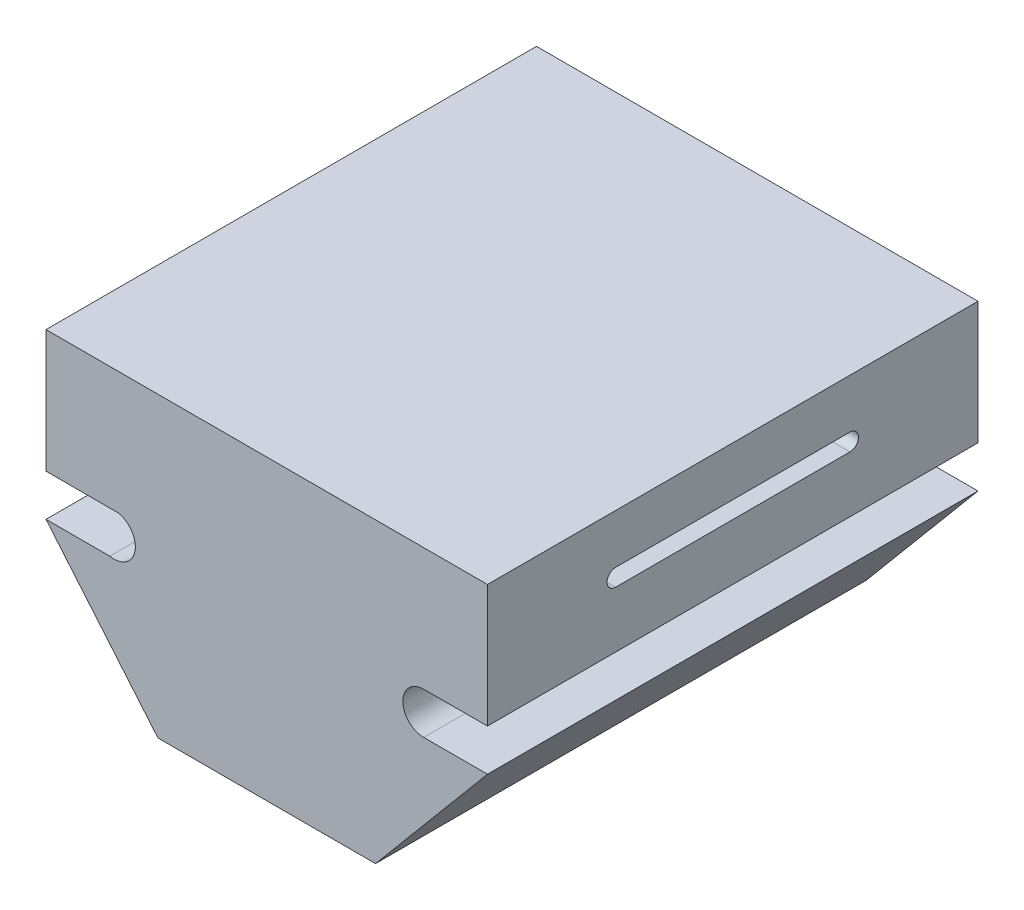
ISO-10303-21;
HEADER;
FILE_DESCRIPTION(('STEP AP214'),'2;1');
FILE_NAME('part.step','',(''),(''),'','','');
FILE_SCHEMA(('AUTOMOTIVE_DESIGN { 1 0 10303 214 1 1 1 1 }'));
ENDSEC;
DATA;
#1=APPLICATION_CONTEXT('core data for automotive mechanical design processes');
#2=APPLICATION_PROTOCOL_DEFINITION('international standard','automotive_design',2000,#1);
#3=PRODUCT_CONTEXT('',#1,'mechanical');
#4=PRODUCT('Part','Part','',(#3));
#5=PRODUCT_RELATED_PRODUCT_CATEGORY('part','',(#4));
#6=PRODUCT_DEFINITION_FORMATION('','',#4);
#7=PRODUCT_DEFINITION_CONTEXT('part definition',#1,'design');
#8=PRODUCT_DEFINITION('design','',#6,#7);
#9=PRODUCT_DEFINITION_SHAPE('','',#8);
#10=(LENGTH_UNIT() NAMED_UNIT(*) SI_UNIT(.MILLI.,.METRE.));
#11=(NAMED_UNIT(*) PLANE_ANGLE_UNIT() SI_UNIT($,.RADIAN.));
#12=(NAMED_UNIT(*) SI_UNIT($,.STERADIAN.) SOLID_ANGLE_UNIT());
#13=UNCERTAINTY_MEASURE_WITH_UNIT(LENGTH_MEASURE(1.E-05),#10,'distance_accuracy_value','');
#14=(GEOMETRIC_REPRESENTATION_CONTEXT(3) GLOBAL_UNCERTAINTY_ASSIGNED_CONTEXT((#13)) GLOBAL_UNIT_ASSIGNED_CONTEXT((#10,
#11,#12)) REPRESENTATION_CONTEXT('',''));
#15=CARTESIAN_POINT('',(0.,0.,0.));
#16=DIRECTION('',(0.,0.,1.));
#17=DIRECTION('',(1.,0.,0.));
#18=AXIS2_PLACEMENT_3D('',#15,#16,#17);
#19=CARTESIAN_POINT('',(23.1655172413793,-1.43103448275862,40.));
#20=DIRECTION('',(0.,0.,-1.));
#21=DIRECTION('',(-1.,0.,0.));
#22=AXIS2_PLACEMENT_3D('',#19,#20,#21);
#23=CYLINDRICAL_SURFACE('',#22,1.7);
#24=CARTESIAN_POINT('',(23.1655172413793,-1.43103448275862,0.));
#25=DIRECTION('',(0.,0.,1.));
#26=DIRECTION('',(1.,0.,0.));
#27=AXIS2_PLACEMENT_3D('',#24,#25,#26);
#28=CIRCLE('',#27,1.7);
#29=CARTESIAN_POINT('',(23.1655172413793,0.268965517241379,0.));
#30=VERTEX_POINT('',#29);
#31=CARTESIAN_POINT('',(23.1655172413793,-3.13103448275862,0.));
#32=VERTEX_POINT('',#31);
#33=EDGE_CURVE('E185',#30,#32,#28,.T.);
#34=ORIENTED_EDGE('',*,*,#33,.F.);
#35=DIRECTION('',(0.,0.,-1.));
#36=VECTOR('',#35,1.);
#37=CARTESIAN_POINT('',(23.1655172413793,0.268965517241379,40.));
#38=LINE('',#37,#36);
#39=CARTESIAN_POINT('',(23.1655172413793,0.268965517241379,40.));
#40=VERTEX_POINT('',#39);
#41=EDGE_CURVE('E11',#40,#30,#38,.T.);
#42=ORIENTED_EDGE('',*,*,#41,.F.);
#43=CARTESIAN_POINT('',(23.1655172413793,-1.43103448275862,40.));
#44=DIRECTION('',(0.,0.,1.));
#45=DIRECTION('',(1.,0.,0.));
#46=AXIS2_PLACEMENT_3D('',#43,#44,#45);
#47=CIRCLE('',#46,1.7);
#48=CARTESIAN_POINT('',(23.1655172413793,-3.13103448275862,40.));
#49=VERTEX_POINT('',#48);
#50=EDGE_CURVE('E186',#40,#49,#47,.T.);
#51=ORIENTED_EDGE('',*,*,#50,.T.);
#52=DIRECTION('',(0.,0.,-1.));
#53=VECTOR('',#52,1.);
#54=CARTESIAN_POINT('',(23.1655172413793,-3.13103448275862,40.));
#55=LINE('',#54,#53);
#56=EDGE_CURVE('E218',#49,#32,#55,.T.);
#57=ORIENTED_EDGE('',*,*,#56,.T.);
#58=EDGE_LOOP('',(#34,#42,#51,#57));
#59=FACE_BOUND('',#58,.T.);
#60=ADVANCED_FACE('F39',(#59),#23,.F.);
#61=CARTESIAN_POINT('',(0.,0.268965517241376,40.));
#62=DIRECTION('',(0.,-1.,0.));
#63=DIRECTION('',(1.,0.,0.));
#64=AXIS2_PLACEMENT_3D('',#61,#62,#63);
#65=PLANE('',#64);
#66=DIRECTION('',(-1.,0.,0.));
#67=VECTOR('',#66,1.);
#68=CARTESIAN_POINT('',(0.,0.268965517241376,0.));
#69=LINE('',#68,#67);
#70=CARTESIAN_POINT('',(28.3655172413793,0.268965517241379,0.));
#71=VERTEX_POINT('',#70);
#72=EDGE_CURVE('E221',#71,#30,#69,.T.);
#73=ORIENTED_EDGE('',*,*,#72,.F.);
#74=DIRECTION('',(0.,0.,-1.));
#75=VECTOR('',#74,1.);
#76=CARTESIAN_POINT('',(28.3655172413793,0.268965517241379,40.));
#77=LINE('',#76,#75);
#78=CARTESIAN_POINT('',(28.3655172413793,0.268965517241379,40.));
#79=VERTEX_POINT('',#78);
#80=EDGE_CURVE('E46',#79,#71,#77,.T.);
#81=ORIENTED_EDGE('',*,*,#80,.F.);
#82=DIRECTION('',(-1.,0.,0.));
#83=VECTOR('',#82,1.);
#84=CARTESIAN_POINT('',(0.,0.268965517241376,40.));
#85=LINE('',#84,#83);
#86=EDGE_CURVE('E189',#79,#40,#85,.T.);
#87=ORIENTED_EDGE('',*,*,#86,.T.);
#88=ORIENTED_EDGE('',*,*,#41,.T.);
#89=EDGE_LOOP('',(#73,#81,#87,#88));
#90=FACE_BOUND('',#89,.T.);
#91=ADVANCED_FACE('F278',(#90),#65,.T.);
#92=CARTESIAN_POINT('',(28.3655172413793,0.,40.));
#93=DIRECTION('',(1.,0.,0.));
#94=DIRECTION('',(0.,0.,-1.));
#95=AXIS2_PLACEMENT_3D('',#92,#93,#94);
#96=PLANE('',#95);
#97=CARTESIAN_POINT('',(28.3655172413793,5.55111140112994,10.45));
#98=DIRECTION('',(1.,0.,0.));
#99=DIRECTION('',(0.,0.,-1.));
#100=AXIS2_PLACEMENT_3D('',#97,#98,#99);
#101=CIRCLE('',#100,0.7);
#102=CARTESIAN_POINT('',(28.3655172413793,4.85111140112994,10.45));
#103=VERTEX_POINT('',#102);
#104=CARTESIAN_POINT('',(28.3655172413793,6.25111140112994,10.45));
#105=VERTEX_POINT('',#104);
#106=EDGE_CURVE('E183',#103,#105,#101,.T.);
#107=ORIENTED_EDGE('',*,*,#106,.F.);
#108=DIRECTION('',(0.,0.,-1.));
#109=VECTOR('',#108,1.);
#110=CARTESIAN_POINT('',(28.3655172413793,4.85111140112994,40.));
#111=LINE('',#110,#109);
#112=CARTESIAN_POINT('',(28.3655172413793,4.85111140112994,29.55));
#113=VERTEX_POINT('',#112);
#114=EDGE_CURVE('E176',#113,#103,#111,.T.);
#115=ORIENTED_EDGE('',*,*,#114,.F.);
#116=CARTESIAN_POINT('',(28.3655172413793,5.55111140112994,29.55));
#117=DIRECTION('',(1.,0.,0.));
#118=DIRECTION('',(0.,0.,-1.));
#119=AXIS2_PLACEMENT_3D('',#116,#117,#118);
#120=CIRCLE('',#119,0.700000000000001);
#121=CARTESIAN_POINT('',(28.3655172413793,6.25111140112994,29.55));
#122=VERTEX_POINT('',#121);
#123=EDGE_CURVE('E156',#122,#113,#120,.T.);
#124=ORIENTED_EDGE('',*,*,#123,.F.);
#125=DIRECTION('',(0.,0.,1.));
#126=VECTOR('',#125,1.);
#127=CARTESIAN_POINT('',(28.3655172413793,6.25111140112994,40.));
#128=LINE('',#127,#126);
#129=EDGE_CURVE('E181',#105,#122,#128,.T.);
#130=ORIENTED_EDGE('',*,*,#129,.F.);
#131=EDGE_LOOP('',(#107,#115,#124,#130));
#132=FACE_BOUND('',#131,.T.);
#133=DIRECTION('',(0.,-1.,0.));
#134=VECTOR('',#133,1.);
#135=CARTESIAN_POINT('',(28.3655172413793,0.,0.));
#136=LINE('',#135,#134);
#137=CARTESIAN_POINT('',(28.3655172413793,10.2689655172414,0.));
#138=VERTEX_POINT('',#137);
#139=EDGE_CURVE('E224',#138,#71,#136,.T.);
#140=ORIENTED_EDGE('',*,*,#139,.F.);
#141=DIRECTION('',(0.,0.,-1.));
#142=VECTOR('',#141,1.);
#143=CARTESIAN_POINT('',(28.3655172413793,10.2689655172414,40.));
#144=LINE('',#143,#142);
#145=CARTESIAN_POINT('',(28.3655172413793,10.2689655172414,40.));
#146=VERTEX_POINT('',#145);
#147=EDGE_CURVE('E270',#146,#138,#144,.T.);
#148=ORIENTED_EDGE('',*,*,#147,.F.);
#149=DIRECTION('',(0.,-1.,0.));
#150=VECTOR('',#149,1.);
#151=CARTESIAN_POINT('',(28.3655172413793,0.,40.));
#152=LINE('',#151,#150);
#153=EDGE_CURVE('E193',#146,#79,#152,.T.);
#154=ORIENTED_EDGE('',*,*,#153,.T.);
#155=ORIENTED_EDGE('',*,*,#80,.T.);
#156=EDGE_LOOP('',(#140,#148,#154,#155));
#157=FACE_BOUND('',#156,.T.);
#158=ADVANCED_FACE('F274',(#132,#157),#96,.T.);
#159=CARTESIAN_POINT('',(0.,10.2689655172414,40.));
#160=DIRECTION('',(0.,1.,0.));
#161=DIRECTION('',(0.,0.,1.));
#162=AXIS2_PLACEMENT_3D('',#159,#160,#161);
#163=PLANE('',#162);
#164=DIRECTION('',(1.,0.,0.));
#165=VECTOR('',#164,1.);
#166=CARTESIAN_POINT('',(0.,10.2689655172414,0.));
#167=LINE('',#166,#165);
#168=CARTESIAN_POINT('',(-7.63448275862069,10.2689655172414,0.));
#169=VERTEX_POINT('',#168);
#170=EDGE_CURVE('E227',#169,#138,#167,.T.);
#171=ORIENTED_EDGE('',*,*,#170,.F.);
#172=DIRECTION('',(0.,0.,-1.));
#173=VECTOR('',#172,1.);
#174=CARTESIAN_POINT('',(-7.63448275862069,10.2689655172414,40.));
#175=LINE('',#174,#173);
#176=CARTESIAN_POINT('',(-7.63448275862069,10.2689655172414,40.));
#177=VERTEX_POINT('',#176);
#178=EDGE_CURVE('E268',#177,#169,#175,.T.);
#179=ORIENTED_EDGE('',*,*,#178,.F.);
#180=DIRECTION('',(1.,0.,0.));
#181=VECTOR('',#180,1.);
#182=CARTESIAN_POINT('',(0.,10.2689655172414,40.));
#183=LINE('',#182,#181);
#184=EDGE_CURVE('E196',#177,#146,#183,.T.);
#185=ORIENTED_EDGE('',*,*,#184,.T.);
#186=ORIENTED_EDGE('',*,*,#147,.T.);
#187=EDGE_LOOP('',(#171,#179,#185,#186));
#188=FACE_BOUND('',#187,.T.);
#189=ADVANCED_FACE('F286',(#188),#163,.T.);
#190=CARTESIAN_POINT('',(-7.63448275862069,0.,40.));
#191=DIRECTION('',(1.,0.,0.));
#192=DIRECTION('',(0.,0.,-1.));
#193=AXIS2_PLACEMENT_3D('',#190,#191,#192);
#194=PLANE('',#193);
#195=DIRECTION('',(0.,0.,1.));
#196=VECTOR('',#195,1.);
#197=CARTESIAN_POINT('',(-7.63448275862069,4.85111140112994,10.45));
#198=LINE('',#197,#196);
#199=CARTESIAN_POINT('',(-7.63448275862069,4.85111140112994,10.45));
#200=VERTEX_POINT('',#199);
#201=CARTESIAN_POINT('',(-7.63448275862069,4.85111140112994,29.55));
#202=VERTEX_POINT('',#201);
#203=EDGE_CURVE('E162',#200,#202,#198,.T.);
#204=ORIENTED_EDGE('',*,*,#203,.F.);
#205=CARTESIAN_POINT('',(-7.63448275862069,5.55111140112994,10.45));
#206=DIRECTION('',(-1.,0.,0.));
#207=DIRECTION('',(0.,0.,1.));
#208=AXIS2_PLACEMENT_3D('',#205,#206,#207);
#209=CIRCLE('',#208,0.7);
#210=CARTESIAN_POINT('',(-7.63448275862069,6.25111140112994,10.45));
#211=VERTEX_POINT('',#210);
#212=EDGE_CURVE('E61',#211,#200,#209,.T.);
#213=ORIENTED_EDGE('',*,*,#212,.F.);
#214=DIRECTION('',(0.,0.,-1.));
#215=VECTOR('',#214,1.);
#216=CARTESIAN_POINT('',(-7.63448275862069,6.25111140112994,10.45));
#217=LINE('',#216,#215);
#218=CARTESIAN_POINT('',(-7.63448275862069,6.25111140112994,29.55));
#219=VERTEX_POINT('',#218);
#220=EDGE_CURVE('E169',#219,#211,#217,.T.);
#221=ORIENTED_EDGE('',*,*,#220,.F.);
#222=CARTESIAN_POINT('',(-7.63448275862069,5.55111140112994,29.55));
#223=DIRECTION('',(-1.,0.,0.));
#224=DIRECTION('',(0.,0.,1.));
#225=AXIS2_PLACEMENT_3D('',#222,#223,#224);
#226=CIRCLE('',#225,0.700000000000001);
#227=EDGE_CURVE('E153',#202,#219,#226,.T.);
#228=ORIENTED_EDGE('',*,*,#227,.F.);
#229=EDGE_LOOP('',(#204,#213,#221,#228));
#230=FACE_BOUND('',#229,.T.);
#231=DIRECTION('',(0.,-1.,0.));
#232=VECTOR('',#231,1.);
#233=CARTESIAN_POINT('',(-7.63448275862069,0.,0.));
#234=LINE('',#233,#232);
#235=CARTESIAN_POINT('',(-7.63448275862069,0.268965517241379,0.));
#236=VERTEX_POINT('',#235);
#237=EDGE_CURVE('E230',#169,#236,#234,.T.);
#238=ORIENTED_EDGE('',*,*,#237,.T.);
#239=DIRECTION('',(0.,0.,-1.));
#240=VECTOR('',#239,1.);
#241=CARTESIAN_POINT('',(-7.63448275862069,0.268965517241379,40.));
#242=LINE('',#241,#240);
#243=CARTESIAN_POINT('',(-7.63448275862069,0.268965517241379,40.));
#244=VERTEX_POINT('',#243);
#245=EDGE_CURVE('E265',#244,#236,#242,.T.);
#246=ORIENTED_EDGE('',*,*,#245,.F.);
#247=DIRECTION('',(0.,-1.,0.));
#248=VECTOR('',#247,1.);
#249=CARTESIAN_POINT('',(-7.63448275862069,0.,40.));
#250=LINE('',#249,#248);
#251=EDGE_CURVE('E199',#177,#244,#250,.T.);
#252=ORIENTED_EDGE('',*,*,#251,.F.);
#253=ORIENTED_EDGE('',*,*,#178,.T.);
#254=EDGE_LOOP('',(#238,#246,#252,#253));
#255=FACE_BOUND('',#254,.T.);
#256=ADVANCED_FACE('F166',(#230,#255),#194,.F.);
#257=CARTESIAN_POINT('',(0.,0.268965517241379,40.));
#258=DIRECTION('',(0.,1.,0.));
#259=DIRECTION('',(0.,0.,1.));
#260=AXIS2_PLACEMENT_3D('',#257,#258,#259);
#261=PLANE('',#260);
#262=DIRECTION('',(1.,0.,0.));
#263=VECTOR('',#262,1.);
#264=CARTESIAN_POINT('',(0.,0.268965517241379,0.));
#265=LINE('',#264,#263);
#266=CARTESIAN_POINT('',(-1.73448275862069,0.268965517241379,0.));
#267=VERTEX_POINT('',#266);
#268=EDGE_CURVE('E232',#236,#267,#265,.T.);
#269=ORIENTED_EDGE('',*,*,#268,.T.);
#270=DIRECTION('',(0.,0.,-1.));
#271=VECTOR('',#270,1.);
#272=CARTESIAN_POINT('',(-1.73448275862069,0.268965517241379,40.));
#273=LINE('',#272,#271);
#274=CARTESIAN_POINT('',(-1.73448275862069,0.268965517241379,40.));
#275=VERTEX_POINT('',#274);
#276=EDGE_CURVE('E262',#275,#267,#273,.T.);
#277=ORIENTED_EDGE('',*,*,#276,.F.);
#278=DIRECTION('',(1.,0.,0.));
#279=VECTOR('',#278,1.);
#280=CARTESIAN_POINT('',(0.,0.268965517241379,40.));
#281=LINE('',#280,#279);
#282=EDGE_CURVE('E201',#244,#275,#281,.T.);
#283=ORIENTED_EDGE('',*,*,#282,.F.);
#284=ORIENTED_EDGE('',*,*,#245,.T.);
#285=EDGE_LOOP('',(#269,#277,#283,#284));
#286=FACE_BOUND('',#285,.T.);
#287=ADVANCED_FACE('F323',(#286),#261,.F.);
#288=CARTESIAN_POINT('',(-2.08448275862069,-1.43103448275862,40.));
#289=DIRECTION('',(0.,0.,-1.));
#290=DIRECTION('',(-1.,0.,0.));
#291=AXIS2_PLACEMENT_3D('',#288,#289,#290);
#292=CYLINDRICAL_SURFACE('',#291,1.73565549577098);
#293=CARTESIAN_POINT('',(-2.08448275862069,-1.43103448275862,0.));
#294=DIRECTION('',(0.,0.,1.));
#295=DIRECTION('',(1.,0.,0.));
#296=AXIS2_PLACEMENT_3D('',#293,#294,#295);
#297=CIRCLE('',#296,1.73565549577098);
#298=CARTESIAN_POINT('',(-2.43448275862069,-3.13103448275862,0.));
#299=VERTEX_POINT('',#298);
#300=EDGE_CURVE('E234',#267,#299,#297,.F.);
#301=ORIENTED_EDGE('',*,*,#300,.T.);
#302=DIRECTION('',(0.,0.,-1.));
#303=VECTOR('',#302,1.);
#304=CARTESIAN_POINT('',(-2.43448275862069,-3.13103448275862,40.));
#305=LINE('',#304,#303);
#306=CARTESIAN_POINT('',(-2.43448275862069,-3.13103448275862,40.));
#307=VERTEX_POINT('',#306);
#308=EDGE_CURVE('E260',#307,#299,#305,.T.);
#309=ORIENTED_EDGE('',*,*,#308,.F.);
#310=CARTESIAN_POINT('',(-2.08448275862069,-1.43103448275862,40.));
#311=DIRECTION('',(0.,0.,1.));
#312=DIRECTION('',(1.,0.,0.));
#313=AXIS2_PLACEMENT_3D('',#310,#311,#312);
#314=CIRCLE('',#313,1.73565549577098);
#315=EDGE_CURVE('E203',#275,#307,#314,.F.);
#316=ORIENTED_EDGE('',*,*,#315,.F.);
#317=ORIENTED_EDGE('',*,*,#276,.T.);
#318=EDGE_LOOP('',(#301,#309,#316,#317));
#319=FACE_BOUND('',#318,.T.);
#320=ADVANCED_FACE('F318',(#319),#292,.F.);
#321=CARTESIAN_POINT('',(0.,-3.13103448275862,40.));
#322=DIRECTION('',(0.,1.,0.));
#323=DIRECTION('',(0.,0.,1.));
#324=AXIS2_PLACEMENT_3D('',#321,#322,#323);
#325=PLANE('',#324);
#326=DIRECTION('',(1.,0.,0.));
#327=VECTOR('',#326,1.);
#328=CARTESIAN_POINT('',(0.,-3.13103448275862,0.));
#329=LINE('',#328,#327);
#330=CARTESIAN_POINT('',(-7.63448275862069,-3.13103448275862,0.));
#331=VERTEX_POINT('',#330);
#332=EDGE_CURVE('E237',#331,#299,#329,.T.);
#333=ORIENTED_EDGE('',*,*,#332,.F.);
#334=DIRECTION('',(0.,0.,-1.));
#335=VECTOR('',#334,1.);
#336=CARTESIAN_POINT('',(-7.63448275862069,-3.13103448275862,40.));
#337=LINE('',#336,#335);
#338=CARTESIAN_POINT('',(-7.63448275862069,-3.13103448275862,40.));
#339=VERTEX_POINT('',#338);
#340=EDGE_CURVE('E258',#339,#331,#337,.T.);
#341=ORIENTED_EDGE('',*,*,#340,.F.);
#342=DIRECTION('',(1.,0.,0.));
#343=VECTOR('',#342,1.);
#344=CARTESIAN_POINT('',(0.,-3.13103448275862,40.));
#345=LINE('',#344,#343);
#346=EDGE_CURVE('E205',#339,#307,#345,.T.);
#347=ORIENTED_EDGE('',*,*,#346,.T.);
#348=ORIENTED_EDGE('',*,*,#308,.T.);
#349=EDGE_LOOP('',(#333,#341,#347,#348));
#350=FACE_BOUND('',#349,.T.);
#351=ADVANCED_FACE('F314',(#350),#325,.T.);
#352=CARTESIAN_POINT('',(-6.02183190532703,-5.05291693077147,40.));
#353=DIRECTION('',(0.766044443118979,0.642787609686538,0.));
#354=DIRECTION('',(-0.642787609686538,0.766044443118979,0.));
#355=AXIS2_PLACEMENT_3D('',#352,#353,#354);
#356=PLANE('',#355);
#357=DIRECTION('',(0.642787609686538,-0.766044443118979,0.));
#358=VECTOR('',#357,1.);
#359=CARTESIAN_POINT('',(-6.02183190532703,-5.05291693077147,0.));
#360=LINE('',#359,#358);
#361=CARTESIAN_POINT('',(1.49310129892814,-14.0088655750481,0.));
#362=VERTEX_POINT('',#361);
#363=EDGE_CURVE('E240',#331,#362,#360,.T.);
#364=ORIENTED_EDGE('',*,*,#363,.T.);
#365=DIRECTION('',(0.,0.,-1.));
#366=VECTOR('',#365,1.);
#367=CARTESIAN_POINT('',(1.49310129892814,-14.0088655750481,40.));
#368=LINE('',#367,#366);
#369=CARTESIAN_POINT('',(1.49310129892814,-14.0088655750481,40.));
#370=VERTEX_POINT('',#369);
#371=EDGE_CURVE('E255',#370,#362,#368,.T.);
#372=ORIENTED_EDGE('',*,*,#371,.F.);
#373=DIRECTION('',(0.642787609686538,-0.766044443118979,0.));
#374=VECTOR('',#373,1.);
#375=CARTESIAN_POINT('',(-6.02183190532703,-5.05291693077147,40.));
#376=LINE('',#375,#374);
#377=EDGE_CURVE('E208',#339,#370,#376,.T.);
#378=ORIENTED_EDGE('',*,*,#377,.F.);
#379=ORIENTED_EDGE('',*,*,#340,.T.);
#380=EDGE_LOOP('',(#364,#372,#378,#379));
#381=FACE_BOUND('',#380,.T.);
#382=ADVANCED_FACE('F311',(#381),#356,.F.);
#383=CARTESIAN_POINT('',(0.,-14.0088655750481,40.));
#384=DIRECTION('',(0.,1.,0.));
#385=DIRECTION('',(-1.,0.,0.));
#386=AXIS2_PLACEMENT_3D('',#383,#384,#385);
#387=PLANE('',#386);
#388=DIRECTION('',(1.,0.,0.));
#389=VECTOR('',#388,1.);
#390=CARTESIAN_POINT('',(0.,-14.0088655750481,0.));
#391=LINE('',#390,#389);
#392=CARTESIAN_POINT('',(19.2379331838305,-14.0088655750481,0.));
#393=VERTEX_POINT('',#392);
#394=EDGE_CURVE('E242',#362,#393,#391,.T.);
#395=ORIENTED_EDGE('',*,*,#394,.T.);
#396=DIRECTION('',(0.,0.,-1.));
#397=VECTOR('',#396,1.);
#398=CARTESIAN_POINT('',(19.2379331838305,-14.0088655750481,40.));
#399=LINE('',#398,#397);
#400=CARTESIAN_POINT('',(19.2379331838305,-14.0088655750481,40.));
#401=VERTEX_POINT('',#400);
#402=EDGE_CURVE('E253',#401,#393,#399,.T.);
#403=ORIENTED_EDGE('',*,*,#402,.F.);
#404=DIRECTION('',(1.,0.,0.));
#405=VECTOR('',#404,1.);
#406=CARTESIAN_POINT('',(0.,-14.0088655750481,40.));
#407=LINE('',#406,#405);
#408=EDGE_CURVE('E210',#370,#401,#407,.T.);
#409=ORIENTED_EDGE('',*,*,#408,.F.);
#410=ORIENTED_EDGE('',*,*,#371,.T.);
#411=EDGE_LOOP('',(#395,#403,#409,#410));
#412=FACE_BOUND('',#411,.T.);
#413=ADVANCED_FACE('F306',(#412),#387,.F.);
#414=CARTESIAN_POINT('',(18.187302326247,-15.2609586740635,40.));
#415=DIRECTION('',(0.766044443118979,-0.642787609686538,0.));
#416=DIRECTION('',(0.642787609686538,0.766044443118979,0.));
#417=AXIS2_PLACEMENT_3D('',#414,#415,#416);
#418=PLANE('',#417);
#419=DIRECTION('',(-0.642787609686538,-0.766044443118979,0.));
#420=VECTOR('',#419,1.);
#421=CARTESIAN_POINT('',(18.187302326247,-15.2609586740635,0.));
#422=LINE('',#421,#420);
#423=CARTESIAN_POINT('',(28.3655172413793,-3.13103448275862,0.));
#424=VERTEX_POINT('',#423);
#425=EDGE_CURVE('E245',#424,#393,#422,.T.);
#426=ORIENTED_EDGE('',*,*,#425,.F.);
#427=DIRECTION('',(0.,0.,-1.));
#428=VECTOR('',#427,1.);
#429=CARTESIAN_POINT('',(28.3655172413793,-3.13103448275862,40.));
#430=LINE('',#429,#428);
#431=CARTESIAN_POINT('',(28.3655172413793,-3.13103448275862,40.));
#432=VERTEX_POINT('',#431);
#433=EDGE_CURVE('E251',#432,#424,#430,.T.);
#434=ORIENTED_EDGE('',*,*,#433,.F.);
#435=DIRECTION('',(-0.642787609686538,-0.766044443118979,0.));
#436=VECTOR('',#435,1.);
#437=CARTESIAN_POINT('',(18.187302326247,-15.2609586740635,40.));
#438=LINE('',#437,#436);
#439=EDGE_CURVE('E212',#432,#401,#438,.T.);
#440=ORIENTED_EDGE('',*,*,#439,.T.);
#441=ORIENTED_EDGE('',*,*,#402,.T.);
#442=EDGE_LOOP('',(#426,#434,#440,#441));
#443=FACE_BOUND('',#442,.T.);
#444=ADVANCED_FACE('F300',(#443),#418,.T.);
#445=CARTESIAN_POINT('',(0.,-3.13103448275862,40.));
#446=DIRECTION('',(0.,1.,0.));
#447=DIRECTION('',(-1.,0.,0.));
#448=AXIS2_PLACEMENT_3D('',#445,#446,#447);
#449=PLANE('',#448);
#450=DIRECTION('',(1.,0.,0.));
#451=VECTOR('',#450,1.);
#452=CARTESIAN_POINT('',(0.,-3.13103448275862,0.));
#453=LINE('',#452,#451);
#454=EDGE_CURVE('E190',#32,#424,#453,.T.);
#455=ORIENTED_EDGE('',*,*,#454,.F.);
#456=ORIENTED_EDGE('',*,*,#56,.F.);
#457=DIRECTION('',(1.,0.,0.));
#458=VECTOR('',#457,1.);
#459=CARTESIAN_POINT('',(0.,-3.13103448275862,40.));
#460=LINE('',#459,#458);
#461=EDGE_CURVE('E215',#49,#432,#460,.T.);
#462=ORIENTED_EDGE('',*,*,#461,.T.);
#463=ORIENTED_EDGE('',*,*,#433,.T.);
#464=EDGE_LOOP('',(#455,#456,#462,#463));
#465=FACE_BOUND('',#464,.T.);
#466=ADVANCED_FACE('F297',(#465),#449,.T.);
#467=CARTESIAN_POINT('',(0.,0.,40.));
#468=DIRECTION('',(0.,0.,1.));
#469=DIRECTION('',(1.,0.,0.));
#470=AXIS2_PLACEMENT_3D('',#467,#468,#469);
#471=PLANE('',#470);
#472=ORIENTED_EDGE('',*,*,#50,.F.);
#473=ORIENTED_EDGE('',*,*,#86,.F.);
#474=ORIENTED_EDGE('',*,*,#153,.F.);
#475=ORIENTED_EDGE('',*,*,#184,.F.);
#476=ORIENTED_EDGE('',*,*,#251,.T.);
#477=ORIENTED_EDGE('',*,*,#282,.T.);
#478=ORIENTED_EDGE('',*,*,#315,.T.);
#479=ORIENTED_EDGE('',*,*,#346,.F.);
#480=ORIENTED_EDGE('',*,*,#377,.T.);
#481=ORIENTED_EDGE('',*,*,#408,.T.);
#482=ORIENTED_EDGE('',*,*,#439,.F.);
#483=ORIENTED_EDGE('',*,*,#461,.F.);
#484=EDGE_LOOP('',(#472,#473,#474,#475,#476,#477,#478,#479,#480,#481,#482,#483));
#485=FACE_BOUND('',#484,.T.);
#486=ADVANCED_FACE('F291',(#485),#471,.T.);
#487=CARTESIAN_POINT('',(0.,0.,0.));
#488=DIRECTION('',(0.,0.,1.));
#489=DIRECTION('',(1.,0.,0.));
#490=AXIS2_PLACEMENT_3D('',#487,#488,#489);
#491=PLANE('',#490);
#492=ORIENTED_EDGE('',*,*,#33,.T.);
#493=ORIENTED_EDGE('',*,*,#454,.T.);
#494=ORIENTED_EDGE('',*,*,#425,.T.);
#495=ORIENTED_EDGE('',*,*,#394,.F.);
#496=ORIENTED_EDGE('',*,*,#363,.F.);
#497=ORIENTED_EDGE('',*,*,#332,.T.);
#498=ORIENTED_EDGE('',*,*,#300,.F.);
#499=ORIENTED_EDGE('',*,*,#268,.F.);
#500=ORIENTED_EDGE('',*,*,#237,.F.);
#501=ORIENTED_EDGE('',*,*,#170,.T.);
#502=ORIENTED_EDGE('',*,*,#139,.T.);
#503=ORIENTED_EDGE('',*,*,#72,.T.);
#504=EDGE_LOOP('',(#492,#493,#494,#495,#496,#497,#498,#499,#500,#501,#502,#503));
#505=FACE_BOUND('',#504,.T.);
#506=ADVANCED_FACE('F281',(#505),#491,.F.);
#507=CARTESIAN_POINT('',(64.3655172413793,5.55111140112994,10.45));
#508=DIRECTION('',(-1.,0.,0.));
#509=DIRECTION('',(0.,0.,1.));
#510=AXIS2_PLACEMENT_3D('',#507,#508,#509);
#511=CYLINDRICAL_SURFACE('',#510,0.7);
#512=ORIENTED_EDGE('',*,*,#106,.T.);
#513=DIRECTION('',(-1.,0.,0.));
#514=VECTOR('',#513,1.);
#515=CARTESIAN_POINT('',(64.3655172413793,6.25111140112994,10.45));
#516=LINE('',#515,#514);
#517=EDGE_CURVE('E174',#105,#211,#516,.T.);
#518=ORIENTED_EDGE('',*,*,#517,.T.);
#519=ORIENTED_EDGE('',*,*,#212,.T.);
#520=DIRECTION('',(-1.,0.,0.));
#521=VECTOR('',#520,1.);
#522=CARTESIAN_POINT('',(64.3655172413793,4.85111140112994,10.45));
#523=LINE('',#522,#521);
#524=EDGE_CURVE('E159',#103,#200,#523,.T.);
#525=ORIENTED_EDGE('',*,*,#524,.F.);
#526=EDGE_LOOP('',(#512,#518,#519,#525));
#527=FACE_BOUND('',#526,.T.);
#528=ADVANCED_FACE('F347',(#527),#511,.F.);
#529=CARTESIAN_POINT('',(64.3655172413793,6.25111140112994,10.45));
#530=DIRECTION('',(0.,1.,0.));
#531=DIRECTION('',(0.,0.,1.));
#532=AXIS2_PLACEMENT_3D('',#529,#530,#531);
#533=PLANE('',#532);
#534=ORIENTED_EDGE('',*,*,#129,.T.);
#535=DIRECTION('',(-1.,0.,0.));
#536=VECTOR('',#535,1.);
#537=CARTESIAN_POINT('',(64.3655172413793,6.25111140112994,29.55));
#538=LINE('',#537,#536);
#539=EDGE_CURVE('E158',#122,#219,#538,.T.);
#540=ORIENTED_EDGE('',*,*,#539,.T.);
#541=ORIENTED_EDGE('',*,*,#220,.T.);
#542=ORIENTED_EDGE('',*,*,#517,.F.);
#543=EDGE_LOOP('',(#534,#540,#541,#542));
#544=FACE_BOUND('',#543,.T.);
#545=ADVANCED_FACE('F349',(#544),#533,.F.);
#546=CARTESIAN_POINT('',(64.3655172413793,5.55111140112994,29.55));
#547=DIRECTION('',(-1.,0.,0.));
#548=DIRECTION('',(0.,0.,1.));
#549=AXIS2_PLACEMENT_3D('',#546,#547,#548);
#550=CYLINDRICAL_SURFACE('',#549,0.700000000000001);
#551=ORIENTED_EDGE('',*,*,#123,.T.);
#552=DIRECTION('',(-1.,0.,0.));
#553=VECTOR('',#552,1.);
#554=CARTESIAN_POINT('',(64.3655172413793,4.85111140112994,29.55));
#555=LINE('',#554,#553);
#556=EDGE_CURVE('E53',#113,#202,#555,.T.);
#557=ORIENTED_EDGE('',*,*,#556,.T.);
#558=ORIENTED_EDGE('',*,*,#227,.T.);
#559=ORIENTED_EDGE('',*,*,#539,.F.);
#560=EDGE_LOOP('',(#551,#557,#558,#559));
#561=FACE_BOUND('',#560,.T.);
#562=ADVANCED_FACE('F150',(#561),#550,.F.);
#563=CARTESIAN_POINT('',(64.3655172413793,4.85111140112994,10.45));
#564=DIRECTION('',(0.,-1.,0.));
#565=DIRECTION('',(0.,0.,-1.));
#566=AXIS2_PLACEMENT_3D('',#563,#564,#565);
#567=PLANE('',#566);
#568=ORIENTED_EDGE('',*,*,#114,.T.);
#569=ORIENTED_EDGE('',*,*,#524,.T.);
#570=ORIENTED_EDGE('',*,*,#203,.T.);
#571=ORIENTED_EDGE('',*,*,#556,.F.);
#572=EDGE_LOOP('',(#568,#569,#570,#571));
#573=FACE_BOUND('',#572,.T.);
#574=ADVANCED_FACE('F163',(#573),#567,.F.);
#575=CLOSED_SHELL('',(#60,#91,#158,#189,#256,#287,#320,#351,#382,#413,#444,#466,#486,#506,#528,
#545,#562,#574));
#576=MANIFOLD_SOLID_BREP('B2',#575);
#577=ADVANCED_BREP_SHAPE_REPRESENTATION('',(#18,#576),#14);
#578=SHAPE_DEFINITION_REPRESENTATION(#9,#577);
ENDSEC;
END-ISO-10303-21;
